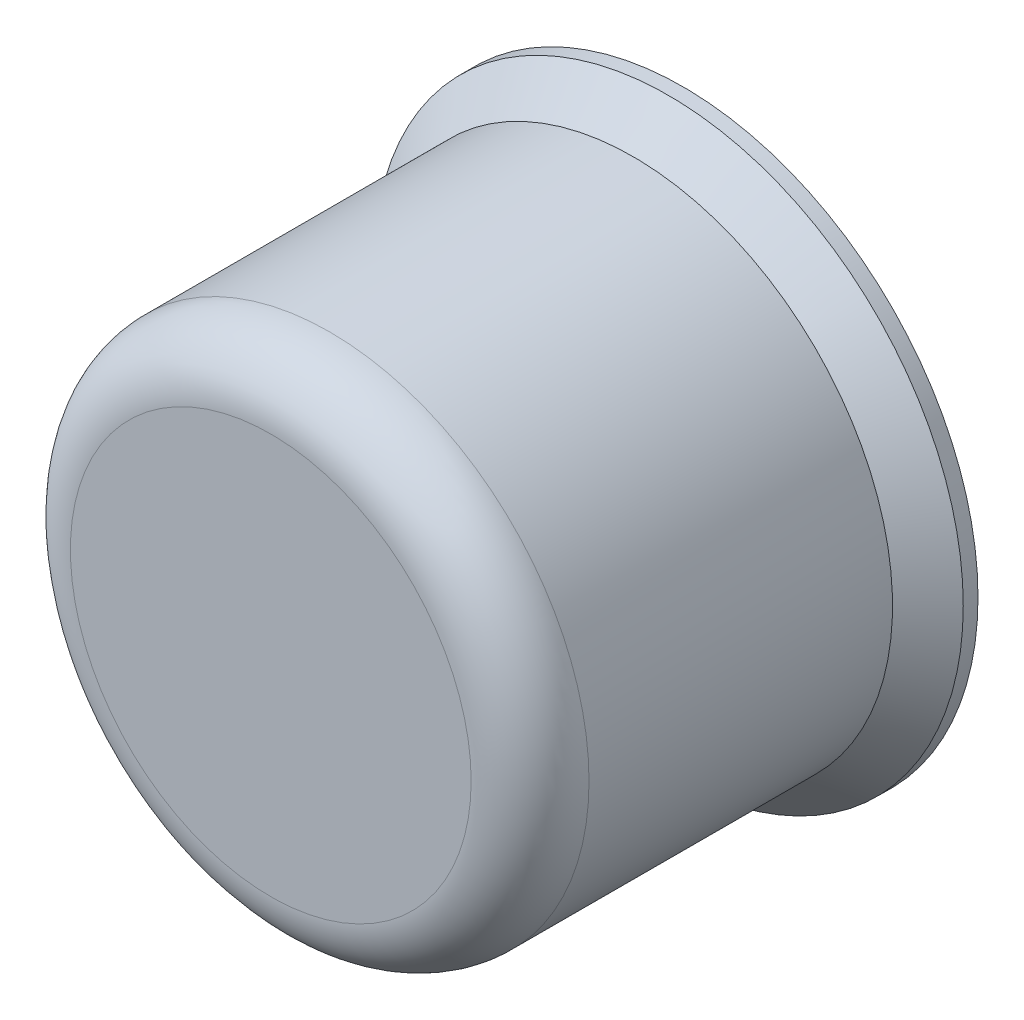
ISO-10303-21;
HEADER;
FILE_DESCRIPTION(('STEP AP214'),'2;1');
FILE_NAME('part.step','',(''),(''),'','','');
FILE_SCHEMA(('AUTOMOTIVE_DESIGN { 1 0 10303 214 1 1 1 1 }'));
ENDSEC;
DATA;
#1=APPLICATION_CONTEXT('core data for automotive mechanical design processes');
#2=APPLICATION_PROTOCOL_DEFINITION('international standard','automotive_design',2000,#1);
#3=PRODUCT_CONTEXT('',#1,'mechanical');
#4=PRODUCT('Part','Part','',(#3));
#5=PRODUCT_RELATED_PRODUCT_CATEGORY('part','',(#4));
#6=PRODUCT_DEFINITION_FORMATION('','',#4);
#7=PRODUCT_DEFINITION_CONTEXT('part definition',#1,'design');
#8=PRODUCT_DEFINITION('design','',#6,#7);
#9=PRODUCT_DEFINITION_SHAPE('','',#8);
#10=(LENGTH_UNIT() NAMED_UNIT(*) SI_UNIT(.MILLI.,.METRE.));
#11=(NAMED_UNIT(*) PLANE_ANGLE_UNIT() SI_UNIT($,.RADIAN.));
#12=(NAMED_UNIT(*) SI_UNIT($,.STERADIAN.) SOLID_ANGLE_UNIT());
#13=UNCERTAINTY_MEASURE_WITH_UNIT(LENGTH_MEASURE(1.E-05),#10,'distance_accuracy_value','');
#14=(GEOMETRIC_REPRESENTATION_CONTEXT(3) GLOBAL_UNCERTAINTY_ASSIGNED_CONTEXT((#13)) GLOBAL_UNIT_ASSIGNED_CONTEXT((#10,
#11,#12)) REPRESENTATION_CONTEXT('',''));
#15=CARTESIAN_POINT('',(0.,0.,0.));
#16=DIRECTION('',(0.,0.,1.));
#17=DIRECTION('',(1.,0.,0.));
#18=AXIS2_PLACEMENT_3D('',#15,#16,#17);
#19=CARTESIAN_POINT('',(0.,0.,1.));
#20=DIRECTION('',(0.,0.,-1.));
#21=DIRECTION('',(-1.,0.,0.));
#22=AXIS2_PLACEMENT_3D('',#19,#20,#21);
#23=CYLINDRICAL_SURFACE('',#22,5.);
#24=CARTESIAN_POINT('',(0.,0.,0.249999999999995));
#25=DIRECTION('',(0.,0.,1.));
#26=DIRECTION('',(1.,0.,0.));
#27=AXIS2_PLACEMENT_3D('',#24,#25,#26);
#28=CIRCLE('',#27,5.);
#29=CARTESIAN_POINT('',(5.,0.,0.249999999999995));
#30=VERTEX_POINT('',#29);
#31=EDGE_CURVE('E56',#30,#30,#28,.F.);
#32=ORIENTED_EDGE('',*,*,#31,.T.);
#33=EDGE_LOOP('',(#32));
#34=FACE_BOUND('',#33,.T.);
#35=CARTESIAN_POINT('',(0.,0.,0.));
#36=DIRECTION('',(0.,0.,1.));
#37=DIRECTION('',(1.,0.,0.));
#38=AXIS2_PLACEMENT_3D('',#35,#36,#37);
#39=CIRCLE('',#38,5.);
#40=CARTESIAN_POINT('',(5.,0.,0.));
#41=VERTEX_POINT('',#40);
#42=EDGE_CURVE('E72',#41,#41,#39,.T.);
#43=ORIENTED_EDGE('',*,*,#42,.T.);
#44=EDGE_LOOP('',(#43));
#45=FACE_BOUND('',#44,.T.);
#46=ADVANCED_FACE('F47',(#34,#45),#23,.T.);
#47=CARTESIAN_POINT('',(0.,0.,0.));
#48=DIRECTION('',(0.,0.,1.));
#49=DIRECTION('',(1.,0.,0.));
#50=AXIS2_PLACEMENT_3D('',#47,#48,#49);
#51=PLANE('',#50);
#52=ORIENTED_EDGE('',*,*,#42,.F.);
#53=EDGE_LOOP('',(#52));
#54=FACE_BOUND('',#53,.T.);
#55=ADVANCED_FACE('F78',(#54),#51,.F.);
#56=CARTESIAN_POINT('',(0.,0.,7.));
#57=DIRECTION('',(0.,0.,-1.));
#58=DIRECTION('',(-1.,0.,0.));
#59=AXIS2_PLACEMENT_3D('',#56,#57,#58);
#60=CYLINDRICAL_SURFACE('',#59,4.4);
#61=CARTESIAN_POINT('',(0.,0.,0.849999999999989));
#62=DIRECTION('',(0.,0.,-1.));
#63=DIRECTION('',(-1.,0.,0.));
#64=AXIS2_PLACEMENT_3D('',#61,#62,#63);
#65=CIRCLE('',#64,4.4);
#66=CARTESIAN_POINT('',(-4.4,0.,0.849999999999989));
#67=VERTEX_POINT('',#66);
#68=EDGE_CURVE('E10',#67,#67,#65,.F.);
#69=ORIENTED_EDGE('',*,*,#68,.T.);
#70=EDGE_LOOP('',(#69));
#71=FACE_BOUND('',#70,.T.);
#72=CARTESIAN_POINT('',(0.,0.,6.));
#73=DIRECTION('',(0.,0.,1.));
#74=DIRECTION('',(1.,0.,0.));
#75=AXIS2_PLACEMENT_3D('',#72,#73,#74);
#76=CIRCLE('',#75,4.4);
#77=CARTESIAN_POINT('',(4.4,0.,6.));
#78=VERTEX_POINT('',#77);
#79=EDGE_CURVE('E61',#78,#78,#76,.F.);
#80=ORIENTED_EDGE('',*,*,#79,.T.);
#81=EDGE_LOOP('',(#80));
#82=FACE_BOUND('',#81,.T.);
#83=ADVANCED_FACE('F80',(#71,#82),#60,.T.);
#84=CARTESIAN_POINT('',(0.,0.,7.));
#85=DIRECTION('',(0.,0.,1.));
#86=DIRECTION('',(1.,0.,0.));
#87=AXIS2_PLACEMENT_3D('',#84,#85,#86);
#88=PLANE('',#87);
#89=CARTESIAN_POINT('',(0.,0.,7.));
#90=DIRECTION('',(0.,0.,1.));
#91=DIRECTION('',(1.,0.,0.));
#92=AXIS2_PLACEMENT_3D('',#89,#90,#91);
#93=CIRCLE('',#92,3.4);
#94=CARTESIAN_POINT('',(3.4,0.,7.));
#95=VERTEX_POINT('',#94);
#96=EDGE_CURVE('E66',#95,#95,#93,.T.);
#97=ORIENTED_EDGE('',*,*,#96,.T.);
#98=EDGE_LOOP('',(#97));
#99=FACE_BOUND('',#98,.T.);
#100=ADVANCED_FACE('F86',(#99),#88,.T.);
#101=CARTESIAN_POINT('',(0.,0.,6.));
#102=DIRECTION('',(0.,0.,1.));
#103=DIRECTION('',(1.,0.,0.));
#104=AXIS2_PLACEMENT_3D('',#101,#102,#103);
#105=TOROIDAL_SURFACE('',#104,3.4,1.);
#106=ORIENTED_EDGE('',*,*,#79,.F.);
#107=EDGE_LOOP('',(#106));
#108=FACE_BOUND('',#107,.T.);
#109=ORIENTED_EDGE('',*,*,#96,.F.);
#110=EDGE_LOOP('',(#109));
#111=FACE_BOUND('',#110,.T.);
#112=ADVANCED_FACE('F91',(#108,#111),#105,.T.);
#113=CARTESIAN_POINT('',(0.,0.,1.));
#114=DIRECTION('',(0.,0.,-1.));
#115=DIRECTION('',(-1.,0.,0.));
#116=AXIS2_PLACEMENT_3D('',#113,#114,#115);
#117=CONICAL_SURFACE('',#116,4.24999999999999,0.785398163397453);
#118=ORIENTED_EDGE('',*,*,#31,.F.);
#119=EDGE_LOOP('',(#118));
#120=FACE_BOUND('',#119,.T.);
#121=ORIENTED_EDGE('',*,*,#68,.F.);
#122=EDGE_LOOP('',(#121));
#123=FACE_BOUND('',#122,.T.);
#124=ADVANCED_FACE('F50',(#120,#123),#117,.T.);
#125=CLOSED_SHELL('',(#46,#55,#83,#100,#112,#124));
#126=MANIFOLD_SOLID_BREP('B2',#125);
#127=ADVANCED_BREP_SHAPE_REPRESENTATION('',(#18,#126),#14);
#128=SHAPE_DEFINITION_REPRESENTATION(#9,#127);
ENDSEC;
END-ISO-10303-21;
